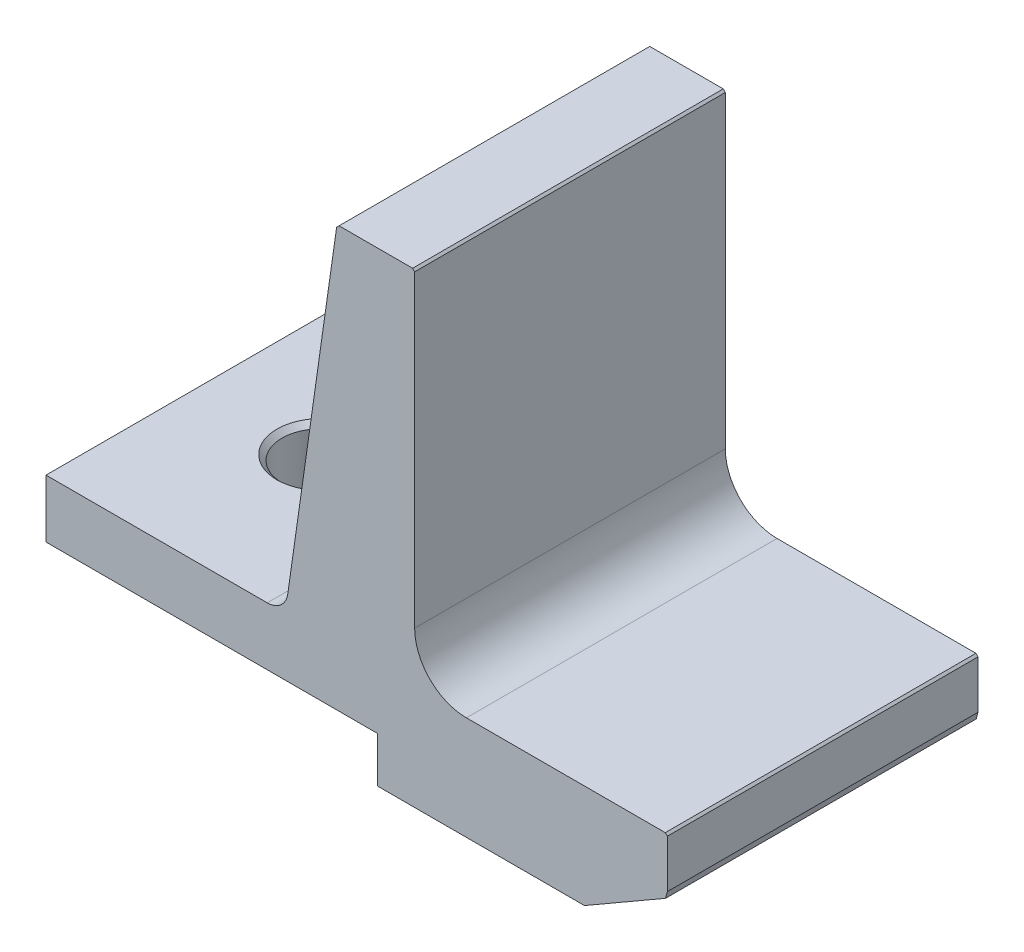
ISO-10303-21;
HEADER;
FILE_DESCRIPTION(('STEP AP214'),'2;1');
FILE_NAME('part.step','',(''),(''),'','','');
FILE_SCHEMA(('AUTOMOTIVE_DESIGN { 1 0 10303 214 1 1 1 1 }'));
ENDSEC;
DATA;
#1=APPLICATION_CONTEXT('core data for automotive mechanical design processes');
#2=APPLICATION_PROTOCOL_DEFINITION('international standard','automotive_design',2000,#1);
#3=PRODUCT_CONTEXT('',#1,'mechanical');
#4=PRODUCT('Part','Part','',(#3));
#5=PRODUCT_RELATED_PRODUCT_CATEGORY('part','',(#4));
#6=PRODUCT_DEFINITION_FORMATION('','',#4);
#7=PRODUCT_DEFINITION_CONTEXT('part definition',#1,'design');
#8=PRODUCT_DEFINITION('design','',#6,#7);
#9=PRODUCT_DEFINITION_SHAPE('','',#8);
#10=(LENGTH_UNIT() NAMED_UNIT(*) SI_UNIT(.MILLI.,.METRE.));
#11=(NAMED_UNIT(*) PLANE_ANGLE_UNIT() SI_UNIT($,.RADIAN.));
#12=(NAMED_UNIT(*) SI_UNIT($,.STERADIAN.) SOLID_ANGLE_UNIT());
#13=UNCERTAINTY_MEASURE_WITH_UNIT(LENGTH_MEASURE(1.E-05),#10,'distance_accuracy_value','');
#14=(GEOMETRIC_REPRESENTATION_CONTEXT(3) GLOBAL_UNCERTAINTY_ASSIGNED_CONTEXT((#13)) GLOBAL_UNIT_ASSIGNED_CONTEXT((#10,
#11,#12)) REPRESENTATION_CONTEXT('',''));
#15=CARTESIAN_POINT('',(0.,0.,0.));
#16=DIRECTION('',(0.,0.,1.));
#17=DIRECTION('',(1.,0.,0.));
#18=AXIS2_PLACEMENT_3D('',#15,#16,#17);
#19=CARTESIAN_POINT('',(0.,44.45,38.1));
#20=DIRECTION('',(-1.,0.,0.));
#21=DIRECTION('',(0.,-1.,0.));
#22=AXIS2_PLACEMENT_3D('',#19,#20,#21);
#23=PLANE('',#22);
#24=DIRECTION('',(0.,1.,0.));
#25=VECTOR('',#24,1.);
#26=CARTESIAN_POINT('',(0.,44.45,0.));
#27=LINE('',#26,#25);
#28=CARTESIAN_POINT('',(0.,6.35000000000001,0.));
#29=VERTEX_POINT('',#28);
#30=CARTESIAN_POINT('',(0.,44.196,0.));
#31=VERTEX_POINT('',#30);
#32=EDGE_CURVE('E204',#29,#31,#27,.T.);
#33=ORIENTED_EDGE('',*,*,#32,.T.);
#34=DIRECTION('',(0.,0.,1.));
#35=VECTOR('',#34,1.);
#36=CARTESIAN_POINT('',(0.,44.196,38.1));
#37=LINE('',#36,#35);
#38=CARTESIAN_POINT('',(0.,44.196,38.1));
#39=VERTEX_POINT('',#38);
#40=EDGE_CURVE('E50',#31,#39,#37,.T.);
#41=ORIENTED_EDGE('',*,*,#40,.T.);
#42=DIRECTION('',(0.,1.,0.));
#43=VECTOR('',#42,1.);
#44=CARTESIAN_POINT('',(0.,44.45,38.1));
#45=LINE('',#44,#43);
#46=CARTESIAN_POINT('',(0.,6.35000000000001,38.1));
#47=VERTEX_POINT('',#46);
#48=EDGE_CURVE('E227',#47,#39,#45,.T.);
#49=ORIENTED_EDGE('',*,*,#48,.F.);
#50=DIRECTION('',(0.,0.,-1.));
#51=VECTOR('',#50,1.);
#52=CARTESIAN_POINT('',(0.,6.35000000000001,0.));
#53=LINE('',#52,#51);
#54=EDGE_CURVE('E251',#47,#29,#53,.T.);
#55=ORIENTED_EDGE('',*,*,#54,.T.);
#56=EDGE_LOOP('',(#33,#41,#49,#55));
#57=FACE_BOUND('',#56,.T.);
#58=ADVANCED_FACE('F41',(#57),#23,.F.);
#59=CARTESIAN_POINT('',(-9.525,44.45,38.1));
#60=DIRECTION('',(0.,-1.,0.));
#61=DIRECTION('',(0.,0.,-1.));
#62=AXIS2_PLACEMENT_3D('',#59,#60,#61);
#63=PLANE('',#62);
#64=DIRECTION('',(-1.,0.,0.));
#65=VECTOR('',#64,1.);
#66=CARTESIAN_POINT('',(-9.525,44.45,38.1));
#67=LINE('',#66,#65);
#68=CARTESIAN_POINT('',(-0.253999999999994,44.45,38.1));
#69=VERTEX_POINT('',#68);
#70=CARTESIAN_POINT('',(-9.27100000000002,44.45,38.1));
#71=VERTEX_POINT('',#70);
#72=EDGE_CURVE('E299',#69,#71,#67,.T.);
#73=ORIENTED_EDGE('',*,*,#72,.F.);
#74=DIRECTION('',(0.,0.,-1.));
#75=VECTOR('',#74,1.);
#76=CARTESIAN_POINT('',(-0.25399999999999,44.45,38.1));
#77=LINE('',#76,#75);
#78=CARTESIAN_POINT('',(-0.253999999999994,44.45,0.));
#79=VERTEX_POINT('',#78);
#80=EDGE_CURVE('E288',#69,#79,#77,.T.);
#81=ORIENTED_EDGE('',*,*,#80,.T.);
#82=DIRECTION('',(-1.,0.,0.));
#83=VECTOR('',#82,1.);
#84=CARTESIAN_POINT('',(-9.525,44.45,0.));
#85=LINE('',#84,#83);
#86=CARTESIAN_POINT('',(-9.27100000000002,44.45,0.));
#87=VERTEX_POINT('',#86);
#88=EDGE_CURVE('E207',#79,#87,#85,.T.);
#89=ORIENTED_EDGE('',*,*,#88,.T.);
#90=DIRECTION('',(0.,0.,1.));
#91=VECTOR('',#90,1.);
#92=CARTESIAN_POINT('',(-9.27100000000002,44.45,38.1));
#93=LINE('',#92,#91);
#94=EDGE_CURVE('E65',#87,#71,#93,.T.);
#95=ORIENTED_EDGE('',*,*,#94,.T.);
#96=EDGE_LOOP('',(#73,#81,#89,#95));
#97=FACE_BOUND('',#96,.T.);
#98=ADVANCED_FACE('F304',(#97),#63,.F.);
#99=CARTESIAN_POINT('',(-15.875,0.,38.1));
#100=DIRECTION('',(0.989949493661166,-0.14142135623731,0.));
#101=DIRECTION('',(0.14142135623731,0.989949493661167,0.));
#102=AXIS2_PLACEMENT_3D('',#99,#100,#101);
#103=PLANE('',#102);
#104=DIRECTION('',(-0.14142135623731,-0.989949493661167,0.));
#105=VECTOR('',#104,1.);
#106=CARTESIAN_POINT('',(-15.875,0.,38.1));
#107=LINE('',#106,#105);
#108=CARTESIAN_POINT('',(-9.56733333333333,44.1536666666667,38.1));
#109=VERTEX_POINT('',#108);
#110=CARTESIAN_POINT('',(-15.5634586064061,2.18078975515723,38.1));
#111=VERTEX_POINT('',#110);
#112=EDGE_CURVE('E173',#109,#111,#107,.T.);
#113=ORIENTED_EDGE('',*,*,#112,.F.);
#114=DIRECTION('',(0.,0.,-1.));
#115=VECTOR('',#114,1.);
#116=CARTESIAN_POINT('',(-9.56733333333333,44.1536666666667,38.1));
#117=LINE('',#116,#115);
#118=CARTESIAN_POINT('',(-9.56733333333333,44.1536666666667,0.));
#119=VERTEX_POINT('',#118);
#120=EDGE_CURVE('E11',#109,#119,#117,.T.);
#121=ORIENTED_EDGE('',*,*,#120,.T.);
#122=DIRECTION('',(-0.14142135623731,-0.989949493661167,0.));
#123=VECTOR('',#122,1.);
#124=CARTESIAN_POINT('',(-15.875,0.,0.));
#125=LINE('',#124,#123);
#126=CARTESIAN_POINT('',(-15.5634586064061,2.18078975515723,0.));
#127=VERTEX_POINT('',#126);
#128=EDGE_CURVE('E210',#119,#127,#125,.T.);
#129=ORIENTED_EDGE('',*,*,#128,.T.);
#130=DIRECTION('',(0.,0.,-1.));
#131=VECTOR('',#130,1.);
#132=CARTESIAN_POINT('',(-15.5634586064061,2.18078975515723,38.1));
#133=LINE('',#132,#131);
#134=EDGE_CURVE('E244',#127,#111,#133,.F.);
#135=ORIENTED_EDGE('',*,*,#134,.T.);
#136=EDGE_LOOP('',(#113,#121,#129,#135));
#137=FACE_BOUND('',#136,.T.);
#138=ADVANCED_FACE('F312',(#137),#103,.F.);
#139=CARTESIAN_POINT('',(-45.212,0.,38.1));
#140=DIRECTION('',(0.,-1.,0.));
#141=DIRECTION('',(0.,0.,-1.));
#142=AXIS2_PLACEMENT_3D('',#139,#140,#141);
#143=PLANE('',#142);
#144=CARTESIAN_POINT('',(-30.5435,0.,19.05));
#145=DIRECTION('',(0.,1.,0.));
#146=DIRECTION('',(0.,0.,1.));
#147=AXIS2_PLACEMENT_3D('',#144,#145,#146);
#148=CIRCLE('',#147,5.3975);
#149=CARTESIAN_POINT('',(-30.5435,0.,24.4475));
#150=VERTEX_POINT('',#149);
#151=EDGE_CURVE('E318',#150,#150,#148,.T.);
#152=ORIENTED_EDGE('',*,*,#151,.F.);
#153=EDGE_LOOP('',(#152));
#154=FACE_BOUND('',#153,.T.);
#155=DIRECTION('',(-1.,0.,0.));
#156=VECTOR('',#155,1.);
#157=CARTESIAN_POINT('',(-45.212,0.,38.1));
#158=LINE('',#157,#156);
#159=CARTESIAN_POINT('',(-18.0779303203055,0.,38.1));
#160=VERTEX_POINT('',#159);
#161=CARTESIAN_POINT('',(-45.212,0.,38.1));
#162=VERTEX_POINT('',#161);
#163=EDGE_CURVE('E161',#160,#162,#158,.T.);
#164=ORIENTED_EDGE('',*,*,#163,.F.);
#165=DIRECTION('',(0.,0.,-1.));
#166=VECTOR('',#165,1.);
#167=CARTESIAN_POINT('',(-18.0779303203055,0.,0.));
#168=LINE('',#167,#166);
#169=CARTESIAN_POINT('',(-18.0779303203055,0.,0.));
#170=VERTEX_POINT('',#169);
#171=EDGE_CURVE('E242',#160,#170,#168,.T.);
#172=ORIENTED_EDGE('',*,*,#171,.T.);
#173=DIRECTION('',(-1.,0.,0.));
#174=VECTOR('',#173,1.);
#175=CARTESIAN_POINT('',(-45.212,0.,0.));
#176=LINE('',#175,#174);
#177=CARTESIAN_POINT('',(-45.212,0.,0.));
#178=VERTEX_POINT('',#177);
#179=EDGE_CURVE('E179',#170,#178,#176,.T.);
#180=ORIENTED_EDGE('',*,*,#179,.T.);
#181=DIRECTION('',(0.,0.,-1.));
#182=VECTOR('',#181,1.);
#183=CARTESIAN_POINT('',(-45.212,0.,38.1));
#184=LINE('',#183,#182);
#185=EDGE_CURVE('E176',#162,#178,#184,.T.);
#186=ORIENTED_EDGE('',*,*,#185,.F.);
#187=EDGE_LOOP('',(#164,#172,#180,#186));
#188=FACE_BOUND('',#187,.T.);
#189=ADVANCED_FACE('F177',(#154,#188),#143,.F.);
#190=CARTESIAN_POINT('',(-45.212,-7.112,38.1));
#191=DIRECTION('',(1.,0.,0.));
#192=DIRECTION('',(0.,0.,-1.));
#193=AXIS2_PLACEMENT_3D('',#190,#191,#192);
#194=PLANE('',#193);
#195=DIRECTION('',(0.,-1.,0.));
#196=VECTOR('',#195,1.);
#197=CARTESIAN_POINT('',(-45.212,-7.112,0.));
#198=LINE('',#197,#196);
#199=CARTESIAN_POINT('',(-45.212,-7.112,0.));
#200=VERTEX_POINT('',#199);
#201=EDGE_CURVE('E213',#178,#200,#198,.T.);
#202=ORIENTED_EDGE('',*,*,#201,.T.);
#203=DIRECTION('',(0.,0.,-1.));
#204=VECTOR('',#203,1.);
#205=CARTESIAN_POINT('',(-45.212,-7.112,38.1));
#206=LINE('',#205,#204);
#207=CARTESIAN_POINT('',(-45.212,-7.112,38.1));
#208=VERTEX_POINT('',#207);
#209=EDGE_CURVE('E183',#208,#200,#206,.T.);
#210=ORIENTED_EDGE('',*,*,#209,.F.);
#211=DIRECTION('',(0.,-1.,0.));
#212=VECTOR('',#211,1.);
#213=CARTESIAN_POINT('',(-45.212,-7.112,38.1));
#214=LINE('',#213,#212);
#215=EDGE_CURVE('E166',#162,#208,#214,.T.);
#216=ORIENTED_EDGE('',*,*,#215,.F.);
#217=ORIENTED_EDGE('',*,*,#185,.T.);
#218=EDGE_LOOP('',(#202,#210,#216,#217));
#219=FACE_BOUND('',#218,.T.);
#220=ADVANCED_FACE('F185',(#219),#194,.F.);
#221=CARTESIAN_POINT('',(-4.57199999999999,-7.112,38.1));
#222=DIRECTION('',(0.,1.,0.));
#223=DIRECTION('',(-1.,0.,0.));
#224=AXIS2_PLACEMENT_3D('',#221,#222,#223);
#225=PLANE('',#224);
#226=CARTESIAN_POINT('',(-30.5435,-7.112,19.05));
#227=DIRECTION('',(0.,1.,0.));
#228=DIRECTION('',(-1.,0.,0.));
#229=AXIS2_PLACEMENT_3D('',#226,#227,#228);
#230=CIRCLE('',#229,4.7625);
#231=CARTESIAN_POINT('',(-35.306,-7.112,19.05));
#232=VERTEX_POINT('',#231);
#233=EDGE_CURVE('E208',#232,#232,#230,.T.);
#234=ORIENTED_EDGE('',*,*,#233,.T.);
#235=EDGE_LOOP('',(#234));
#236=FACE_BOUND('',#235,.T.);
#237=DIRECTION('',(1.,0.,0.));
#238=VECTOR('',#237,1.);
#239=CARTESIAN_POINT('',(-4.57199999999999,-7.112,0.));
#240=LINE('',#239,#238);
#241=CARTESIAN_POINT('',(-4.57199999999999,-7.112,0.));
#242=VERTEX_POINT('',#241);
#243=EDGE_CURVE('E215',#200,#242,#240,.T.);
#244=ORIENTED_EDGE('',*,*,#243,.T.);
#245=DIRECTION('',(0.,0.,-1.));
#246=VECTOR('',#245,1.);
#247=CARTESIAN_POINT('',(-4.57199999999999,-7.112,38.1));
#248=LINE('',#247,#246);
#249=CARTESIAN_POINT('',(-4.57199999999999,-7.112,38.1));
#250=VERTEX_POINT('',#249);
#251=EDGE_CURVE('E230',#250,#242,#248,.T.);
#252=ORIENTED_EDGE('',*,*,#251,.F.);
#253=DIRECTION('',(1.,0.,0.));
#254=VECTOR('',#253,1.);
#255=CARTESIAN_POINT('',(-4.57199999999999,-7.112,38.1));
#256=LINE('',#255,#254);
#257=EDGE_CURVE('E188',#208,#250,#256,.T.);
#258=ORIENTED_EDGE('',*,*,#257,.F.);
#259=ORIENTED_EDGE('',*,*,#209,.T.);
#260=EDGE_LOOP('',(#244,#252,#258,#259));
#261=FACE_BOUND('',#260,.T.);
#262=ADVANCED_FACE('F331',(#236,#261),#225,.F.);
#263=CARTESIAN_POINT('',(-4.57199999999999,-12.7,38.1));
#264=DIRECTION('',(1.,0.,0.));
#265=DIRECTION('',(0.,0.,-1.));
#266=AXIS2_PLACEMENT_3D('',#263,#264,#265);
#267=PLANE('',#266);
#268=DIRECTION('',(0.,-1.,0.));
#269=VECTOR('',#268,1.);
#270=CARTESIAN_POINT('',(-4.57199999999999,-12.7,0.));
#271=LINE('',#270,#269);
#272=CARTESIAN_POINT('',(-4.57199999999999,-12.7,0.));
#273=VERTEX_POINT('',#272);
#274=EDGE_CURVE('E217',#242,#273,#271,.T.);
#275=ORIENTED_EDGE('',*,*,#274,.T.);
#276=DIRECTION('',(0.,0.,-1.));
#277=VECTOR('',#276,1.);
#278=CARTESIAN_POINT('',(-4.57199999999999,-12.7,38.1));
#279=LINE('',#278,#277);
#280=CARTESIAN_POINT('',(-4.57199999999999,-12.7,38.1));
#281=VERTEX_POINT('',#280);
#282=EDGE_CURVE('E203',#281,#273,#279,.T.);
#283=ORIENTED_EDGE('',*,*,#282,.F.);
#284=DIRECTION('',(0.,-1.,0.));
#285=VECTOR('',#284,1.);
#286=CARTESIAN_POINT('',(-4.57199999999999,-12.7,38.1));
#287=LINE('',#286,#285);
#288=EDGE_CURVE('E190',#250,#281,#287,.T.);
#289=ORIENTED_EDGE('',*,*,#288,.F.);
#290=ORIENTED_EDGE('',*,*,#251,.T.);
#291=EDGE_LOOP('',(#275,#283,#289,#290));
#292=FACE_BOUND('',#291,.T.);
#293=ADVANCED_FACE('F478',(#292),#267,.F.);
#294=CARTESIAN_POINT('',(30.988,-12.7,38.1));
#295=DIRECTION('',(0.,1.,0.));
#296=DIRECTION('',(-1.,0.,0.));
#297=AXIS2_PLACEMENT_3D('',#294,#295,#296);
#298=PLANE('',#297);
#299=DIRECTION('',(1.,0.,0.));
#300=VECTOR('',#299,1.);
#301=CARTESIAN_POINT('',(30.988,-12.7,0.));
#302=LINE('',#301,#300);
#303=CARTESIAN_POINT('',(20.828,-12.7,0.));
#304=VERTEX_POINT('',#303);
#305=EDGE_CURVE('E219',#273,#304,#302,.T.);
#306=ORIENTED_EDGE('',*,*,#305,.T.);
#307=DIRECTION('',(0.,0.,1.));
#308=VECTOR('',#307,1.);
#309=CARTESIAN_POINT('',(20.828,-12.7,38.1));
#310=LINE('',#309,#308);
#311=CARTESIAN_POINT('',(20.828,-12.7,38.1));
#312=VERTEX_POINT('',#311);
#313=EDGE_CURVE('E238',#304,#312,#310,.T.);
#314=ORIENTED_EDGE('',*,*,#313,.T.);
#315=DIRECTION('',(1.,0.,0.));
#316=VECTOR('',#315,1.);
#317=CARTESIAN_POINT('',(30.988,-12.7,38.1));
#318=LINE('',#317,#316);
#319=EDGE_CURVE('E195',#281,#312,#318,.T.);
#320=ORIENTED_EDGE('',*,*,#319,.F.);
#321=ORIENTED_EDGE('',*,*,#282,.T.);
#322=EDGE_LOOP('',(#306,#314,#320,#321));
#323=FACE_BOUND('',#322,.T.);
#324=ADVANCED_FACE('F469',(#323),#298,.F.);
#325=CARTESIAN_POINT('',(30.988,0.,38.1));
#326=DIRECTION('',(-1.,0.,0.));
#327=DIRECTION('',(0.,0.,1.));
#328=AXIS2_PLACEMENT_3D('',#325,#326,#327);
#329=PLANE('',#328);
#330=DIRECTION('',(0.,1.,0.));
#331=VECTOR('',#330,1.);
#332=CARTESIAN_POINT('',(30.988,0.,38.1));
#333=LINE('',#332,#331);
#334=CARTESIAN_POINT('',(30.988,-6.14018035991088,38.1));
#335=VERTEX_POINT('',#334);
#336=CARTESIAN_POINT('',(30.988,-0.254000000000004,38.1));
#337=VERTEX_POINT('',#336);
#338=EDGE_CURVE('E198',#335,#337,#333,.T.);
#339=ORIENTED_EDGE('',*,*,#338,.F.);
#340=DIRECTION('',(0.,0.,-1.));
#341=VECTOR('',#340,1.);
#342=CARTESIAN_POINT('',(30.988,-6.14018035991088,0.));
#343=LINE('',#342,#341);
#344=CARTESIAN_POINT('',(30.988,-6.14018035991088,0.));
#345=VERTEX_POINT('',#344);
#346=EDGE_CURVE('E264',#335,#345,#343,.T.);
#347=ORIENTED_EDGE('',*,*,#346,.T.);
#348=DIRECTION('',(0.,1.,0.));
#349=VECTOR('',#348,1.);
#350=CARTESIAN_POINT('',(30.988,0.,0.));
#351=LINE('',#350,#349);
#352=CARTESIAN_POINT('',(30.988,-0.254000000000004,0.));
#353=VERTEX_POINT('',#352);
#354=EDGE_CURVE('E222',#345,#353,#351,.T.);
#355=ORIENTED_EDGE('',*,*,#354,.T.);
#356=DIRECTION('',(0.,0.,1.));
#357=VECTOR('',#356,1.);
#358=CARTESIAN_POINT('',(30.988,-0.254000000000004,38.1));
#359=LINE('',#358,#357);
#360=EDGE_CURVE('E262',#353,#337,#359,.T.);
#361=ORIENTED_EDGE('',*,*,#360,.T.);
#362=EDGE_LOOP('',(#339,#347,#355,#361));
#363=FACE_BOUND('',#362,.T.);
#364=ADVANCED_FACE('F459',(#363),#329,.F.);
#365=CARTESIAN_POINT('',(0.,0.,38.1));
#366=DIRECTION('',(0.,-1.,0.));
#367=DIRECTION('',(0.,0.,-1.));
#368=AXIS2_PLACEMENT_3D('',#365,#366,#367);
#369=PLANE('',#368);
#370=DIRECTION('',(-1.,0.,0.));
#371=VECTOR('',#370,1.);
#372=CARTESIAN_POINT('',(0.,0.,38.1));
#373=LINE('',#372,#371);
#374=CARTESIAN_POINT('',(30.734,0.,38.1));
#375=VERTEX_POINT('',#374);
#376=CARTESIAN_POINT('',(6.35,0.,38.1));
#377=VERTEX_POINT('',#376);
#378=EDGE_CURVE('E201',#375,#377,#373,.T.);
#379=ORIENTED_EDGE('',*,*,#378,.F.);
#380=DIRECTION('',(0.,0.,-1.));
#381=VECTOR('',#380,1.);
#382=CARTESIAN_POINT('',(30.734,0.,38.1));
#383=LINE('',#382,#381);
#384=CARTESIAN_POINT('',(30.734,0.,0.));
#385=VERTEX_POINT('',#384);
#386=EDGE_CURVE('E284',#375,#385,#383,.T.);
#387=ORIENTED_EDGE('',*,*,#386,.T.);
#388=DIRECTION('',(-1.,0.,0.));
#389=VECTOR('',#388,1.);
#390=CARTESIAN_POINT('',(0.,0.,0.));
#391=LINE('',#390,#389);
#392=CARTESIAN_POINT('',(6.35,0.,0.));
#393=VERTEX_POINT('',#392);
#394=EDGE_CURVE('E225',#385,#393,#391,.T.);
#395=ORIENTED_EDGE('',*,*,#394,.T.);
#396=DIRECTION('',(0.,0.,-1.));
#397=VECTOR('',#396,1.);
#398=CARTESIAN_POINT('',(6.35,0.,38.1));
#399=LINE('',#398,#397);
#400=EDGE_CURVE('E254',#393,#377,#399,.F.);
#401=ORIENTED_EDGE('',*,*,#400,.T.);
#402=EDGE_LOOP('',(#379,#387,#395,#401));
#403=FACE_BOUND('',#402,.T.);
#404=ADVANCED_FACE('F450',(#403),#369,.F.);
#405=CARTESIAN_POINT('',(0.,0.,38.1));
#406=DIRECTION('',(0.,0.,1.));
#407=DIRECTION('',(1.,0.,0.));
#408=AXIS2_PLACEMENT_3D('',#405,#406,#407);
#409=PLANE('',#408);
#410=DIRECTION('',(-0.86602540378444,-0.499999999999998,0.));
#411=VECTOR('',#410,1.);
#412=CARTESIAN_POINT('',(10.7062613140311,-18.5437885550111,38.1));
#413=LINE('',#412,#411);
#414=CARTESIAN_POINT('',(30.7680295474388,-6.9611212650334,38.1));
#415=VERTEX_POINT('',#414);
#416=EDGE_CURVE('E240',#312,#415,#413,.F.);
#417=ORIENTED_EDGE('',*,*,#416,.T.);
#418=DIRECTION('',(-0.258819045102521,-0.965925826289068,0.));
#419=VECTOR('',#418,1.);
#420=CARTESIAN_POINT('',(30.4472426962138,-8.15831409220491,38.1));
#421=LINE('',#420,#419);
#422=EDGE_CURVE('E282',#415,#335,#421,.F.);
#423=ORIENTED_EDGE('',*,*,#422,.T.);
#424=ORIENTED_EDGE('',*,*,#338,.T.);
#425=DIRECTION('',(0.707106781186548,-0.707106781186547,0.));
#426=VECTOR('',#425,1.);
#427=CARTESIAN_POINT('',(15.367,15.367,38.1));
#428=LINE('',#427,#426);
#429=EDGE_CURVE('E280',#337,#375,#428,.F.);
#430=ORIENTED_EDGE('',*,*,#429,.T.);
#431=ORIENTED_EDGE('',*,*,#378,.T.);
#432=CARTESIAN_POINT('',(6.35,6.35000000000001,38.1));
#433=DIRECTION('',(0.,0.,1.));
#434=DIRECTION('',(1.,0.,0.));
#435=AXIS2_PLACEMENT_3D('',#432,#433,#434);
#436=CIRCLE('',#435,6.35);
#437=EDGE_CURVE('E260',#377,#47,#436,.F.);
#438=ORIENTED_EDGE('',*,*,#437,.T.);
#439=ORIENTED_EDGE('',*,*,#48,.T.);
#440=DIRECTION('',(0.707106781186547,-0.707106781186548,0.));
#441=VECTOR('',#440,1.);
#442=CARTESIAN_POINT('',(22.098,22.098,38.1));
#443=LINE('',#442,#441);
#444=EDGE_CURVE('E278',#39,#69,#443,.F.);
#445=ORIENTED_EDGE('',*,*,#444,.T.);
#446=ORIENTED_EDGE('',*,*,#72,.T.);
#447=DIRECTION('',(0.707106781186548,0.707106781186548,0.));
#448=VECTOR('',#447,1.);
#449=CARTESIAN_POINT('',(-26.8605,26.8605,38.1));
#450=LINE('',#449,#448);
#451=EDGE_CURVE('E57',#71,#109,#450,.F.);
#452=ORIENTED_EDGE('',*,*,#451,.T.);
#453=ORIENTED_EDGE('',*,*,#112,.T.);
#454=CARTESIAN_POINT('',(-18.0779303203055,2.54,38.1));
#455=DIRECTION('',(0.,0.,1.));
#456=DIRECTION('',(1.,0.,0.));
#457=AXIS2_PLACEMENT_3D('',#454,#455,#456);
#458=CIRCLE('',#457,2.54);
#459=EDGE_CURVE('E169',#111,#160,#458,.F.);
#460=ORIENTED_EDGE('',*,*,#459,.T.);
#461=ORIENTED_EDGE('',*,*,#163,.T.);
#462=ORIENTED_EDGE('',*,*,#215,.T.);
#463=ORIENTED_EDGE('',*,*,#257,.T.);
#464=ORIENTED_EDGE('',*,*,#288,.T.);
#465=ORIENTED_EDGE('',*,*,#319,.T.);
#466=EDGE_LOOP('',(#417,#423,#424,#430,#431,#438,#439,#445,#446,#452,#453,#460,#461,#462,#463,
#464,#465));
#467=FACE_BOUND('',#466,.T.);
#468=ADVANCED_FACE('F164',(#467),#409,.T.);
#469=CARTESIAN_POINT('',(0.,0.,0.));
#470=DIRECTION('',(0.,0.,1.));
#471=DIRECTION('',(1.,0.,0.));
#472=AXIS2_PLACEMENT_3D('',#469,#470,#471);
#473=PLANE('',#472);
#474=ORIENTED_EDGE('',*,*,#354,.F.);
#475=DIRECTION('',(0.258819045102521,0.965925826289068,0.));
#476=VECTOR('',#475,1.);
#477=CARTESIAN_POINT('',(30.988,-6.14018035991088,0.));
#478=LINE('',#477,#476);
#479=CARTESIAN_POINT('',(30.7680295474387,-6.9611212650334,0.));
#480=VERTEX_POINT('',#479);
#481=EDGE_CURVE('E273',#345,#480,#478,.F.);
#482=ORIENTED_EDGE('',*,*,#481,.T.);
#483=DIRECTION('',(0.86602540378444,0.499999999999998,0.));
#484=VECTOR('',#483,1.);
#485=CARTESIAN_POINT('',(30.988,-6.8341212650334,0.));
#486=LINE('',#485,#484);
#487=EDGE_CURVE('E182',#480,#304,#486,.F.);
#488=ORIENTED_EDGE('',*,*,#487,.T.);
#489=ORIENTED_EDGE('',*,*,#305,.F.);
#490=ORIENTED_EDGE('',*,*,#274,.F.);
#491=ORIENTED_EDGE('',*,*,#243,.F.);
#492=ORIENTED_EDGE('',*,*,#201,.F.);
#493=ORIENTED_EDGE('',*,*,#179,.F.);
#494=CARTESIAN_POINT('',(-18.0779303203055,2.54,0.));
#495=DIRECTION('',(0.,0.,1.));
#496=DIRECTION('',(1.,0.,0.));
#497=AXIS2_PLACEMENT_3D('',#494,#495,#496);
#498=CIRCLE('',#497,2.54);
#499=EDGE_CURVE('E247',#170,#127,#498,.T.);
#500=ORIENTED_EDGE('',*,*,#499,.T.);
#501=ORIENTED_EDGE('',*,*,#128,.F.);
#502=DIRECTION('',(-0.707106781186548,-0.707106781186548,0.));
#503=VECTOR('',#502,1.);
#504=CARTESIAN_POINT('',(-9.56733333333333,44.1536666666667,0.));
#505=LINE('',#504,#503);
#506=EDGE_CURVE('E267',#119,#87,#505,.F.);
#507=ORIENTED_EDGE('',*,*,#506,.T.);
#508=ORIENTED_EDGE('',*,*,#88,.F.);
#509=DIRECTION('',(-0.707106781186547,0.707106781186548,0.));
#510=VECTOR('',#509,1.);
#511=CARTESIAN_POINT('',(-0.25399999999999,44.45,0.));
#512=LINE('',#511,#510);
#513=EDGE_CURVE('E269',#79,#31,#512,.F.);
#514=ORIENTED_EDGE('',*,*,#513,.T.);
#515=ORIENTED_EDGE('',*,*,#32,.F.);
#516=CARTESIAN_POINT('',(6.35,6.35000000000001,0.));
#517=DIRECTION('',(0.,0.,1.));
#518=DIRECTION('',(1.,0.,0.));
#519=AXIS2_PLACEMENT_3D('',#516,#517,#518);
#520=CIRCLE('',#519,6.35);
#521=EDGE_CURVE('E257',#29,#393,#520,.T.);
#522=ORIENTED_EDGE('',*,*,#521,.T.);
#523=ORIENTED_EDGE('',*,*,#394,.F.);
#524=DIRECTION('',(-0.707106781186548,0.707106781186547,0.));
#525=VECTOR('',#524,1.);
#526=CARTESIAN_POINT('',(30.734,0.,0.));
#527=LINE('',#526,#525);
#528=EDGE_CURVE('E271',#385,#353,#527,.F.);
#529=ORIENTED_EDGE('',*,*,#528,.T.);
#530=EDGE_LOOP('',(#474,#482,#488,#489,#490,#491,#492,#493,#500,#501,#507,#508,#514,#515,#522,
#523,#529));
#531=FACE_BOUND('',#530,.T.);
#532=ADVANCED_FACE('F307',(#531),#473,.F.);
#533=CARTESIAN_POINT('',(-30.5435,0.,19.05));
#534=DIRECTION('',(0.,1.,0.));
#535=DIRECTION('',(0.,0.,1.));
#536=AXIS2_PLACEMENT_3D('',#533,#534,#535);
#537=CYLINDRICAL_SURFACE('',#536,4.7625);
#538=CARTESIAN_POINT('',(-30.5435,-0.635000000000002,19.05));
#539=DIRECTION('',(0.,1.,0.));
#540=DIRECTION('',(0.,0.,1.));
#541=AXIS2_PLACEMENT_3D('',#538,#539,#540);
#542=CIRCLE('',#541,4.7625);
#543=CARTESIAN_POINT('',(-30.5435,-0.635000000000002,23.8125));
#544=VERTEX_POINT('',#543);
#545=EDGE_CURVE('E236',#544,#544,#542,.T.);
#546=ORIENTED_EDGE('',*,*,#545,.T.);
#547=EDGE_LOOP('',(#546));
#548=FACE_BOUND('',#547,.T.);
#549=ORIENTED_EDGE('',*,*,#233,.F.);
#550=EDGE_LOOP('',(#549));
#551=FACE_BOUND('',#550,.T.);
#552=ADVANCED_FACE('F423',(#548,#551),#537,.F.);
#553=CARTESIAN_POINT('',(-30.5435,0.,19.05));
#554=DIRECTION('',(0.,1.,0.));
#555=DIRECTION('',(0.,0.,1.));
#556=AXIS2_PLACEMENT_3D('',#553,#554,#555);
#557=CONICAL_SURFACE('',#556,5.3975,0.78539816339745);
#558=ORIENTED_EDGE('',*,*,#545,.F.);
#559=EDGE_LOOP('',(#558));
#560=FACE_BOUND('',#559,.T.);
#561=ORIENTED_EDGE('',*,*,#151,.T.);
#562=EDGE_LOOP('',(#561));
#563=FACE_BOUND('',#562,.T.);
#564=ADVANCED_FACE('F322',(#560,#563),#557,.F.);
#565=CARTESIAN_POINT('',(30.988,-6.8341212650334,38.1));
#566=DIRECTION('',(-0.499999999999998,0.86602540378444,0.));
#567=DIRECTION('',(0.,0.,-1.));
#568=AXIS2_PLACEMENT_3D('',#565,#566,#567);
#569=PLANE('',#568);
#570=ORIENTED_EDGE('',*,*,#487,.F.);
#571=DIRECTION('',(0.,0.,-1.));
#572=VECTOR('',#571,1.);
#573=CARTESIAN_POINT('',(30.7680295474387,-6.9611212650334,38.1));
#574=LINE('',#573,#572);
#575=EDGE_CURVE('E275',#480,#415,#574,.F.);
#576=ORIENTED_EDGE('',*,*,#575,.T.);
#577=ORIENTED_EDGE('',*,*,#416,.F.);
#578=ORIENTED_EDGE('',*,*,#313,.F.);
#579=EDGE_LOOP('',(#570,#576,#577,#578));
#580=FACE_BOUND('',#579,.T.);
#581=ADVANCED_FACE('F344',(#580),#569,.F.);
#582=CARTESIAN_POINT('',(-18.0779303203055,2.54,38.1));
#583=DIRECTION('',(0.,0.,1.));
#584=DIRECTION('',(1.,0.,0.));
#585=AXIS2_PLACEMENT_3D('',#582,#583,#584);
#586=CYLINDRICAL_SURFACE('',#585,2.54);
#587=ORIENTED_EDGE('',*,*,#459,.F.);
#588=ORIENTED_EDGE('',*,*,#134,.F.);
#589=ORIENTED_EDGE('',*,*,#499,.F.);
#590=ORIENTED_EDGE('',*,*,#171,.F.);
#591=EDGE_LOOP('',(#587,#588,#589,#590));
#592=FACE_BOUND('',#591,.T.);
#593=ADVANCED_FACE('F350',(#592),#586,.F.);
#594=CARTESIAN_POINT('',(6.35,6.35000000000001,38.1));
#595=DIRECTION('',(0.,0.,1.));
#596=DIRECTION('',(1.,0.,0.));
#597=AXIS2_PLACEMENT_3D('',#594,#595,#596);
#598=CYLINDRICAL_SURFACE('',#597,6.35);
#599=ORIENTED_EDGE('',*,*,#437,.F.);
#600=ORIENTED_EDGE('',*,*,#400,.F.);
#601=ORIENTED_EDGE('',*,*,#521,.F.);
#602=ORIENTED_EDGE('',*,*,#54,.F.);
#603=EDGE_LOOP('',(#599,#600,#601,#602));
#604=FACE_BOUND('',#603,.T.);
#605=ADVANCED_FACE('F353',(#604),#598,.F.);
#606=CARTESIAN_POINT('',(30.988,-6.14018035991088,38.1));
#607=DIRECTION('',(-0.965925826289068,0.258819045102521,0.));
#608=DIRECTION('',(0.,0.,-1.));
#609=AXIS2_PLACEMENT_3D('',#606,#607,#608);
#610=PLANE('',#609);
#611=ORIENTED_EDGE('',*,*,#422,.F.);
#612=ORIENTED_EDGE('',*,*,#575,.F.);
#613=ORIENTED_EDGE('',*,*,#481,.F.);
#614=ORIENTED_EDGE('',*,*,#346,.F.);
#615=EDGE_LOOP('',(#611,#612,#613,#614));
#616=FACE_BOUND('',#615,.T.);
#617=ADVANCED_FACE('F356',(#616),#610,.F.);
#618=CARTESIAN_POINT('',(30.734,0.,38.1));
#619=DIRECTION('',(-0.707106781186547,-0.707106781186548,0.));
#620=DIRECTION('',(0.,0.,-1.));
#621=AXIS2_PLACEMENT_3D('',#618,#619,#620);
#622=PLANE('',#621);
#623=ORIENTED_EDGE('',*,*,#429,.F.);
#624=ORIENTED_EDGE('',*,*,#360,.F.);
#625=ORIENTED_EDGE('',*,*,#528,.F.);
#626=ORIENTED_EDGE('',*,*,#386,.F.);
#627=EDGE_LOOP('',(#623,#624,#625,#626));
#628=FACE_BOUND('',#627,.T.);
#629=ADVANCED_FACE('F363',(#628),#622,.F.);
#630=CARTESIAN_POINT('',(-0.25399999999999,44.45,38.1));
#631=DIRECTION('',(-0.707106781186548,-0.707106781186547,0.));
#632=DIRECTION('',(0.,0.,-1.));
#633=AXIS2_PLACEMENT_3D('',#630,#631,#632);
#634=PLANE('',#633);
#635=ORIENTED_EDGE('',*,*,#444,.F.);
#636=ORIENTED_EDGE('',*,*,#40,.F.);
#637=ORIENTED_EDGE('',*,*,#513,.F.);
#638=ORIENTED_EDGE('',*,*,#80,.F.);
#639=EDGE_LOOP('',(#635,#636,#637,#638));
#640=FACE_BOUND('',#639,.T.);
#641=ADVANCED_FACE('F302',(#640),#634,.F.);
#642=CARTESIAN_POINT('',(-9.56733333333333,44.1536666666667,38.1));
#643=DIRECTION('',(0.707106781186547,-0.707106781186547,0.));
#644=DIRECTION('',(0.,0.,-1.));
#645=AXIS2_PLACEMENT_3D('',#642,#643,#644);
#646=PLANE('',#645);
#647=ORIENTED_EDGE('',*,*,#451,.F.);
#648=ORIENTED_EDGE('',*,*,#94,.F.);
#649=ORIENTED_EDGE('',*,*,#506,.F.);
#650=ORIENTED_EDGE('',*,*,#120,.F.);
#651=EDGE_LOOP('',(#647,#648,#649,#650));
#652=FACE_BOUND('',#651,.T.);
#653=ADVANCED_FACE('F44',(#652),#646,.F.);
#654=CLOSED_SHELL('',(#58,#98,#138,#189,#220,#262,#293,#324,#364,#404,#468,#532,#552,#564,#581,
#593,#605,#617,#629,#641,#653));
#655=MANIFOLD_SOLID_BREP('B2',#654);
#656=ADVANCED_BREP_SHAPE_REPRESENTATION('',(#18,#655),#14);
#657=SHAPE_DEFINITION_REPRESENTATION(#9,#656);
ENDSEC;
END-ISO-10303-21;
